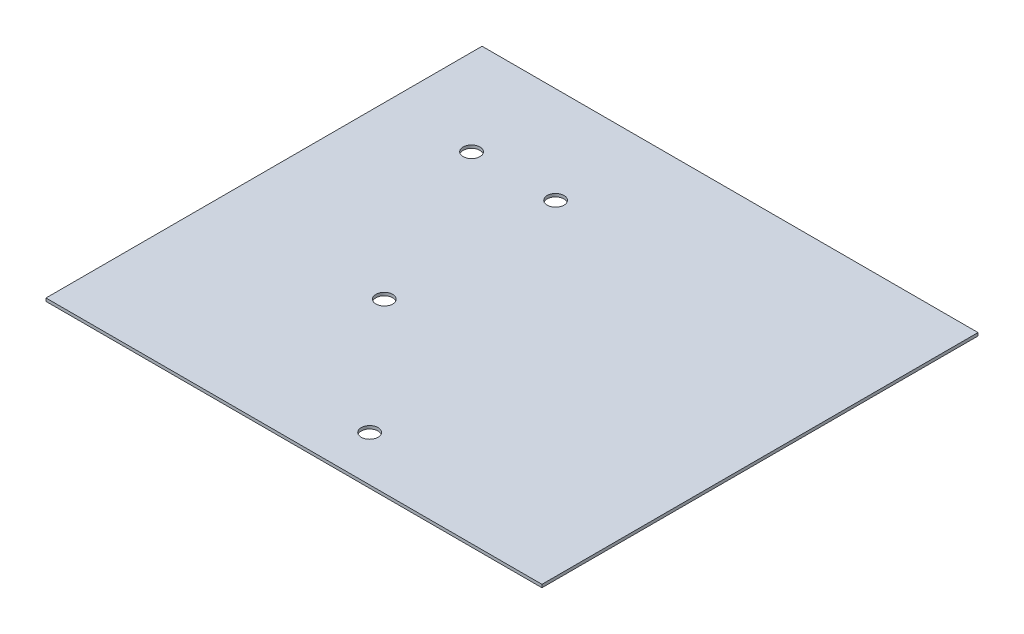
ISO-10303-21;
HEADER;
FILE_DESCRIPTION(('STEP AP214'),'2;1');
FILE_NAME('part.step','',(''),(''),'','','');
FILE_SCHEMA(('AUTOMOTIVE_DESIGN { 1 0 10303 214 1 1 1 1 }'));
ENDSEC;
DATA;
#1=APPLICATION_CONTEXT('core data for automotive mechanical design processes');
#2=APPLICATION_PROTOCOL_DEFINITION('international standard','automotive_design',2000,#1);
#3=PRODUCT_CONTEXT('',#1,'mechanical');
#4=PRODUCT('Part','Part','',(#3));
#5=PRODUCT_RELATED_PRODUCT_CATEGORY('part','',(#4));
#6=PRODUCT_DEFINITION_FORMATION('','',#4);
#7=PRODUCT_DEFINITION_CONTEXT('part definition',#1,'design');
#8=PRODUCT_DEFINITION('design','',#6,#7);
#9=PRODUCT_DEFINITION_SHAPE('','',#8);
#10=(LENGTH_UNIT() NAMED_UNIT(*) SI_UNIT(.MILLI.,.METRE.));
#11=(NAMED_UNIT(*) PLANE_ANGLE_UNIT() SI_UNIT($,.RADIAN.));
#12=(NAMED_UNIT(*) SI_UNIT($,.STERADIAN.) SOLID_ANGLE_UNIT());
#13=UNCERTAINTY_MEASURE_WITH_UNIT(LENGTH_MEASURE(1.E-05),#10,'distance_accuracy_value','');
#14=(GEOMETRIC_REPRESENTATION_CONTEXT(3) GLOBAL_UNCERTAINTY_ASSIGNED_CONTEXT((#13)) GLOBAL_UNIT_ASSIGNED_CONTEXT((#10,
#11,#12)) REPRESENTATION_CONTEXT('',''));
#15=CARTESIAN_POINT('',(0.,0.,0.));
#16=DIRECTION('',(0.,0.,1.));
#17=DIRECTION('',(1.,0.,0.));
#18=AXIS2_PLACEMENT_3D('',#15,#16,#17);
#19=CARTESIAN_POINT('',(0.,0.911859999999987,0.));
#20=DIRECTION('',(0.,-1.,0.));
#21=DIRECTION('',(0.,0.,-1.));
#22=AXIS2_PLACEMENT_3D('',#19,#20,#21);
#23=PLANE('',#22);
#24=DIRECTION('',(0.,0.,1.));
#25=VECTOR('',#24,1.);
#26=CARTESIAN_POINT('',(0.,0.911859999999987,0.));
#27=LINE('',#26,#25);
#28=CARTESIAN_POINT('',(0.,0.911859999999987,-131.7625));
#29=VERTEX_POINT('',#28);
#30=CARTESIAN_POINT('',(0.,0.911859999999987,0.));
#31=VERTEX_POINT('',#30);
#32=EDGE_CURVE('E89',#29,#31,#27,.T.);
#33=ORIENTED_EDGE('',*,*,#32,.T.);
#34=DIRECTION('',(1.,0.,0.));
#35=VECTOR('',#34,1.);
#36=CARTESIAN_POINT('',(0.,0.911859999999987,0.));
#37=LINE('',#36,#35);
#38=CARTESIAN_POINT('',(149.86,0.911859999999987,0.));
#39=VERTEX_POINT('',#38);
#40=EDGE_CURVE('E84',#31,#39,#37,.T.);
#41=ORIENTED_EDGE('',*,*,#40,.T.);
#42=DIRECTION('',(0.,0.,-1.));
#43=VECTOR('',#42,1.);
#44=CARTESIAN_POINT('',(149.86,0.911859999999987,0.));
#45=LINE('',#44,#43);
#46=CARTESIAN_POINT('',(149.86,0.911859999999987,-131.7625));
#47=VERTEX_POINT('',#46);
#48=EDGE_CURVE('E87',#39,#47,#45,.T.);
#49=ORIENTED_EDGE('',*,*,#48,.T.);
#50=DIRECTION('',(-1.,0.,0.));
#51=VECTOR('',#50,1.);
#52=CARTESIAN_POINT('',(0.,0.911859999999987,-131.7625));
#53=LINE('',#52,#51);
#54=EDGE_CURVE('E54',#47,#29,#53,.T.);
#55=ORIENTED_EDGE('',*,*,#54,.T.);
#56=EDGE_LOOP('',(#33,#41,#49,#55));
#57=FACE_BOUND('',#56,.T.);
#58=CARTESIAN_POINT('',(51.435,0.911859999999987,-50.8));
#59=DIRECTION('',(0.,1.,0.));
#60=DIRECTION('',(0.,0.,1.));
#61=AXIS2_PLACEMENT_3D('',#58,#59,#60);
#62=CIRCLE('',#61,2.54);
#63=CARTESIAN_POINT('',(51.435,0.911859999999987,-53.34));
#64=VERTEX_POINT('',#63);
#65=EDGE_CURVE('E110',#64,#64,#62,.T.);
#66=ORIENTED_EDGE('',*,*,#65,.F.);
#67=EDGE_LOOP('',(#66));
#68=FACE_BOUND('',#67,.T.);
#69=CARTESIAN_POINT('',(26.035,0.911859999999987,-102.5525));
#70=DIRECTION('',(0.,1.,0.));
#71=DIRECTION('',(0.,0.,1.));
#72=AXIS2_PLACEMENT_3D('',#69,#70,#71);
#73=CIRCLE('',#72,2.53999999999999);
#74=CARTESIAN_POINT('',(26.035,0.911859999999987,-105.0925));
#75=VERTEX_POINT('',#74);
#76=EDGE_CURVE('E134',#75,#75,#73,.T.);
#77=ORIENTED_EDGE('',*,*,#76,.F.);
#78=EDGE_LOOP('',(#77));
#79=FACE_BOUND('',#78,.T.);
#80=CARTESIAN_POINT('',(51.435,0.911859999999987,-102.5525));
#81=DIRECTION('',(0.,1.,0.));
#82=DIRECTION('',(0.,0.,1.));
#83=AXIS2_PLACEMENT_3D('',#80,#81,#82);
#84=CIRCLE('',#83,2.54);
#85=CARTESIAN_POINT('',(51.435,0.911859999999987,-105.0925));
#86=VERTEX_POINT('',#85);
#87=EDGE_CURVE('E142',#86,#86,#84,.T.);
#88=ORIENTED_EDGE('',*,*,#87,.F.);
#89=EDGE_LOOP('',(#88));
#90=FACE_BOUND('',#89,.T.);
#91=CARTESIAN_POINT('',(84.074,0.911859999999987,-13.716));
#92=DIRECTION('',(0.,1.,0.));
#93=DIRECTION('',(0.,0.,1.));
#94=AXIS2_PLACEMENT_3D('',#91,#92,#93);
#95=CIRCLE('',#94,2.54);
#96=CARTESIAN_POINT('',(84.074,0.911859999999987,-16.256));
#97=VERTEX_POINT('',#96);
#98=EDGE_CURVE('E150',#97,#97,#95,.T.);
#99=ORIENTED_EDGE('',*,*,#98,.F.);
#100=EDGE_LOOP('',(#99));
#101=FACE_BOUND('',#100,.T.);
#102=ADVANCED_FACE('F36',(#57,#68,#79,#90,#101),#23,.F.);
#103=CARTESIAN_POINT('',(0.,0.,0.));
#104=DIRECTION('',(0.,-1.,0.));
#105=DIRECTION('',(0.,0.,-1.));
#106=AXIS2_PLACEMENT_3D('',#103,#104,#105);
#107=PLANE('',#106);
#108=CARTESIAN_POINT('',(51.435,0.,-102.5525));
#109=DIRECTION('',(0.,1.,0.));
#110=DIRECTION('',(0.,0.,1.));
#111=AXIS2_PLACEMENT_3D('',#108,#109,#110);
#112=CIRCLE('',#111,2.54);
#113=CARTESIAN_POINT('',(51.435,0.,-105.0925));
#114=VERTEX_POINT('',#113);
#115=EDGE_CURVE('E146',#114,#114,#112,.T.);
#116=ORIENTED_EDGE('',*,*,#115,.T.);
#117=EDGE_LOOP('',(#116));
#118=FACE_BOUND('',#117,.T.);
#119=CARTESIAN_POINT('',(51.435,0.,-50.8));
#120=DIRECTION('',(0.,1.,0.));
#121=DIRECTION('',(0.,0.,1.));
#122=AXIS2_PLACEMENT_3D('',#119,#120,#121);
#123=CIRCLE('',#122,2.54);
#124=CARTESIAN_POINT('',(51.435,0.,-53.34));
#125=VERTEX_POINT('',#124);
#126=EDGE_CURVE('E130',#125,#125,#123,.T.);
#127=ORIENTED_EDGE('',*,*,#126,.T.);
#128=EDGE_LOOP('',(#127));
#129=FACE_BOUND('',#128,.T.);
#130=DIRECTION('',(0.,0.,1.));
#131=VECTOR('',#130,1.);
#132=CARTESIAN_POINT('',(0.,0.,0.));
#133=LINE('',#132,#131);
#134=CARTESIAN_POINT('',(0.,0.,-131.7625));
#135=VERTEX_POINT('',#134);
#136=CARTESIAN_POINT('',(0.,0.,0.));
#137=VERTEX_POINT('',#136);
#138=EDGE_CURVE('E106',#135,#137,#133,.T.);
#139=ORIENTED_EDGE('',*,*,#138,.F.);
#140=DIRECTION('',(-1.,0.,0.));
#141=VECTOR('',#140,1.);
#142=CARTESIAN_POINT('',(0.,0.,-131.7625));
#143=LINE('',#142,#141);
#144=CARTESIAN_POINT('',(149.86,0.,-131.7625));
#145=VERTEX_POINT('',#144);
#146=EDGE_CURVE('E77',#145,#135,#143,.T.);
#147=ORIENTED_EDGE('',*,*,#146,.F.);
#148=DIRECTION('',(0.,0.,-1.));
#149=VECTOR('',#148,1.);
#150=CARTESIAN_POINT('',(149.86,0.,0.));
#151=LINE('',#150,#149);
#152=CARTESIAN_POINT('',(149.86,0.,0.));
#153=VERTEX_POINT('',#152);
#154=EDGE_CURVE('E71',#153,#145,#151,.T.);
#155=ORIENTED_EDGE('',*,*,#154,.F.);
#156=DIRECTION('',(1.,0.,0.));
#157=VECTOR('',#156,1.);
#158=CARTESIAN_POINT('',(0.,0.,0.));
#159=LINE('',#158,#157);
#160=EDGE_CURVE('E94',#137,#153,#159,.T.);
#161=ORIENTED_EDGE('',*,*,#160,.F.);
#162=EDGE_LOOP('',(#139,#147,#155,#161));
#163=FACE_BOUND('',#162,.T.);
#164=CARTESIAN_POINT('',(26.035,0.,-102.5525));
#165=DIRECTION('',(0.,1.,0.));
#166=DIRECTION('',(0.,0.,1.));
#167=AXIS2_PLACEMENT_3D('',#164,#165,#166);
#168=CIRCLE('',#167,2.53999999999999);
#169=CARTESIAN_POINT('',(26.035,0.,-105.0925));
#170=VERTEX_POINT('',#169);
#171=EDGE_CURVE('E138',#170,#170,#168,.T.);
#172=ORIENTED_EDGE('',*,*,#171,.T.);
#173=EDGE_LOOP('',(#172));
#174=FACE_BOUND('',#173,.T.);
#175=CARTESIAN_POINT('',(84.074,0.,-13.716));
#176=DIRECTION('',(0.,1.,0.));
#177=DIRECTION('',(0.,0.,1.));
#178=AXIS2_PLACEMENT_3D('',#175,#176,#177);
#179=CIRCLE('',#178,2.54);
#180=CARTESIAN_POINT('',(84.074,0.,-16.256));
#181=VERTEX_POINT('',#180);
#182=EDGE_CURVE('E154',#181,#181,#179,.T.);
#183=ORIENTED_EDGE('',*,*,#182,.T.);
#184=EDGE_LOOP('',(#183));
#185=FACE_BOUND('',#184,.T.);
#186=ADVANCED_FACE('F124',(#118,#129,#163,#174,#185),#107,.T.);
#187=CARTESIAN_POINT('',(0.,0.911859999999987,0.));
#188=DIRECTION('',(1.,0.,0.));
#189=DIRECTION('',(0.,0.,-1.));
#190=AXIS2_PLACEMENT_3D('',#187,#188,#189);
#191=PLANE('',#190);
#192=ORIENTED_EDGE('',*,*,#138,.T.);
#193=DIRECTION('',(0.,-1.,0.));
#194=VECTOR('',#193,1.);
#195=CARTESIAN_POINT('',(0.,0.911859999999987,0.));
#196=LINE('',#195,#194);
#197=EDGE_CURVE('E11',#31,#137,#196,.T.);
#198=ORIENTED_EDGE('',*,*,#197,.F.);
#199=ORIENTED_EDGE('',*,*,#32,.F.);
#200=DIRECTION('',(0.,-1.,0.));
#201=VECTOR('',#200,1.);
#202=CARTESIAN_POINT('',(0.,0.911859999999987,-131.7625));
#203=LINE('',#202,#201);
#204=EDGE_CURVE('E102',#29,#135,#203,.T.);
#205=ORIENTED_EDGE('',*,*,#204,.T.);
#206=EDGE_LOOP('',(#192,#198,#199,#205));
#207=FACE_BOUND('',#206,.T.);
#208=ADVANCED_FACE('F38',(#207),#191,.F.);
#209=CARTESIAN_POINT('',(0.,0.911859999999987,0.));
#210=DIRECTION('',(0.,0.,-1.));
#211=DIRECTION('',(-1.,0.,0.));
#212=AXIS2_PLACEMENT_3D('',#209,#210,#211);
#213=PLANE('',#212);
#214=ORIENTED_EDGE('',*,*,#160,.T.);
#215=DIRECTION('',(0.,-1.,0.));
#216=VECTOR('',#215,1.);
#217=CARTESIAN_POINT('',(149.86,0.911859999999987,0.));
#218=LINE('',#217,#216);
#219=EDGE_CURVE('E46',#39,#153,#218,.T.);
#220=ORIENTED_EDGE('',*,*,#219,.F.);
#221=ORIENTED_EDGE('',*,*,#40,.F.);
#222=ORIENTED_EDGE('',*,*,#197,.T.);
#223=EDGE_LOOP('',(#214,#220,#221,#222));
#224=FACE_BOUND('',#223,.T.);
#225=ADVANCED_FACE('F93',(#224),#213,.F.);
#226=CARTESIAN_POINT('',(149.86,0.911859999999987,0.));
#227=DIRECTION('',(-1.,0.,0.));
#228=DIRECTION('',(0.,0.,1.));
#229=AXIS2_PLACEMENT_3D('',#226,#227,#228);
#230=PLANE('',#229);
#231=ORIENTED_EDGE('',*,*,#154,.T.);
#232=DIRECTION('',(0.,-1.,0.));
#233=VECTOR('',#232,1.);
#234=CARTESIAN_POINT('',(149.86,0.911859999999987,-131.7625));
#235=LINE('',#234,#233);
#236=EDGE_CURVE('E96',#47,#145,#235,.T.);
#237=ORIENTED_EDGE('',*,*,#236,.F.);
#238=ORIENTED_EDGE('',*,*,#48,.F.);
#239=ORIENTED_EDGE('',*,*,#219,.T.);
#240=EDGE_LOOP('',(#231,#237,#238,#239));
#241=FACE_BOUND('',#240,.T.);
#242=ADVANCED_FACE('F97',(#241),#230,.F.);
#243=CARTESIAN_POINT('',(0.,0.911859999999987,-131.7625));
#244=DIRECTION('',(0.,0.,1.));
#245=DIRECTION('',(1.,0.,0.));
#246=AXIS2_PLACEMENT_3D('',#243,#244,#245);
#247=PLANE('',#246);
#248=ORIENTED_EDGE('',*,*,#146,.T.);
#249=ORIENTED_EDGE('',*,*,#204,.F.);
#250=ORIENTED_EDGE('',*,*,#54,.F.);
#251=ORIENTED_EDGE('',*,*,#236,.T.);
#252=EDGE_LOOP('',(#248,#249,#250,#251));
#253=FACE_BOUND('',#252,.T.);
#254=ADVANCED_FACE('F121',(#253),#247,.F.);
#255=CARTESIAN_POINT('',(51.435,0.911859999999987,-50.8));
#256=DIRECTION('',(0.,-1.,0.));
#257=DIRECTION('',(0.,0.,-1.));
#258=AXIS2_PLACEMENT_3D('',#255,#256,#257);
#259=CYLINDRICAL_SURFACE('',#258,2.54);
#260=CARTESIAN_POINT('',(51.435,0.911859999999987,-53.34));
#261=CARTESIAN_POINT('',(51.435,0.90236145833332,-53.34));
#262=CARTESIAN_POINT('',(51.435,0.892862916666654,-53.34));
#263=CARTESIAN_POINT('',(51.435,0.873865833333321,-53.34));
#264=CARTESIAN_POINT('',(51.435,0.864367291666654,-53.34));
#265=CARTESIAN_POINT('',(51.435,0.845370208333321,-53.34));
#266=CARTESIAN_POINT('',(51.435,0.835871666666654,-53.34));
#267=CARTESIAN_POINT('',(51.435,0.816874583333321,-53.34));
#268=CARTESIAN_POINT('',(51.435,0.807376041666655,-53.34));
#269=CARTESIAN_POINT('',(51.435,0.788378958333322,-53.34));
#270=CARTESIAN_POINT('',(51.435,0.778880416666655,-53.34));
#271=CARTESIAN_POINT('',(51.435,0.759883333333322,-53.34));
#272=CARTESIAN_POINT('',(51.435,0.750384791666656,-53.34));
#273=CARTESIAN_POINT('',(51.435,0.731387708333323,-53.34));
#274=CARTESIAN_POINT('',(51.435,0.721889166666656,-53.34));
#275=CARTESIAN_POINT('',(51.435,0.702892083333323,-53.34));
#276=CARTESIAN_POINT('',(51.435,0.693393541666657,-53.34));
#277=CARTESIAN_POINT('',(51.435,0.674396458333324,-53.34));
#278=CARTESIAN_POINT('',(51.435,0.664897916666657,-53.34));
#279=CARTESIAN_POINT('',(51.435,0.645900833333324,-53.34));
#280=CARTESIAN_POINT('',(51.435,0.636402291666657,-53.34));
#281=CARTESIAN_POINT('',(51.435,0.617405208333324,-53.34));
#282=CARTESIAN_POINT('',(51.435,0.607906666666658,-53.34));
#283=CARTESIAN_POINT('',(51.435,0.588909583333325,-53.34));
#284=CARTESIAN_POINT('',(51.435,0.579411041666658,-53.34));
#285=CARTESIAN_POINT('',(51.435,0.560413958333325,-53.34));
#286=CARTESIAN_POINT('',(51.435,0.550915416666659,-53.34));
#287=CARTESIAN_POINT('',(51.435,0.531918333333326,-53.34));
#288=CARTESIAN_POINT('',(51.435,0.522419791666659,-53.34));
#289=CARTESIAN_POINT('',(51.435,0.503422708333326,-53.34));
#290=CARTESIAN_POINT('',(51.435,0.49392416666666,-53.34));
#291=CARTESIAN_POINT('',(51.435,0.474927083333326,-53.34));
#292=CARTESIAN_POINT('',(51.435,0.46542854166666,-53.34));
#293=CARTESIAN_POINT('',(51.435,0.446431458333327,-53.34));
#294=CARTESIAN_POINT('',(51.435,0.43693291666666,-53.34));
#295=CARTESIAN_POINT('',(51.435,0.417935833333327,-53.34));
#296=CARTESIAN_POINT('',(51.435,0.408437291666661,-53.34));
#297=CARTESIAN_POINT('',(51.435,0.389440208333328,-53.34));
#298=CARTESIAN_POINT('',(51.435,0.379941666666661,-53.34));
#299=CARTESIAN_POINT('',(51.435,0.360944583333328,-53.34));
#300=CARTESIAN_POINT('',(51.435,0.351446041666662,-53.34));
#301=CARTESIAN_POINT('',(51.435,0.332448958333329,-53.34));
#302=CARTESIAN_POINT('',(51.435,0.322950416666662,-53.34));
#303=CARTESIAN_POINT('',(51.435,0.303953333333329,-53.34));
#304=CARTESIAN_POINT('',(51.435,0.294454791666662,-53.34));
#305=CARTESIAN_POINT('',(51.435,0.275457708333329,-53.34));
#306=CARTESIAN_POINT('',(51.435,0.265959166666663,-53.34));
#307=CARTESIAN_POINT('',(51.435,0.24696208333333,-53.34));
#308=CARTESIAN_POINT('',(51.435,0.237463541666663,-53.34));
#309=CARTESIAN_POINT('',(51.435,0.21846645833333,-53.34));
#310=CARTESIAN_POINT('',(51.435,0.208967916666664,-53.34));
#311=CARTESIAN_POINT('',(51.435,0.189970833333331,-53.34));
#312=CARTESIAN_POINT('',(51.435,0.180472291666664,-53.34));
#313=CARTESIAN_POINT('',(51.435,0.161475208333331,-53.34));
#314=CARTESIAN_POINT('',(51.435,0.151976666666665,-53.34));
#315=CARTESIAN_POINT('',(51.435,0.132979583333331,-53.34));
#316=CARTESIAN_POINT('',(51.435,0.123481041666665,-53.34));
#317=CARTESIAN_POINT('',(51.435,0.104483958333332,-53.34));
#318=CARTESIAN_POINT('',(51.435,0.0949854166666654,-53.34));
#319=CARTESIAN_POINT('',(51.435,0.0759883333333323,-53.34));
#320=CARTESIAN_POINT('',(51.435,0.0664897916666658,-53.34));
#321=CARTESIAN_POINT('',(51.435,0.0474927083333327,-53.34));
#322=CARTESIAN_POINT('',(51.435,0.0379941666666662,-53.34));
#323=CARTESIAN_POINT('',(51.435,0.0189970833333332,-53.34));
#324=CARTESIAN_POINT('',(51.435,0.00949854166666662,-53.34));
#325=CARTESIAN_POINT('',(51.435,0.,-53.34));
#326=B_SPLINE_CURVE_WITH_KNOTS('',3,(#260,#261,#262,#263,#264,#265,#266,#267,#268,#269,#270,
#271,#272,#273,#274,#275,#276,#277,#278,#279,#280,#281,#282,#283,#284,#285,#286,#287,#288,#289,
#290,#291,#292,#293,#294,#295,#296,#297,#298,#299,#300,#301,#302,#303,#304,#305,#306,#307,#308,
#309,#310,#311,#312,#313,#314,#315,#316,#317,#318,#319,#320,#321,#322,#323,#324,#325),
.UNSPECIFIED.,.F.,.F.,(4,2,2,2,2,2,2,2,2,2,2,2,2,2,2,2,2,2,2,2,2,2,2,2,2,2,2,2,2,2,2,2,4),(0.,
0.0284956249999995,0.056991249999999,0.0854868749999986,0.113982499999998,0.142478124999998,
0.170973749999997,0.199469374999997,0.227964999999997,0.256460624999996,0.284956249999996,
0.313451874999995,0.341947499999995,0.370443124999994,0.398938749999994,0.427434374999994,
0.455929999999993,0.484425624999993,0.512921249999992,0.541416874999992,0.569912499999991,
0.598408124999991,0.626903749999991,0.65539937499999,0.68389499999999,0.712390624999989,
0.740886249999989,0.769381874999989,0.797877499999988,0.826373124999988,0.854868749999987,
0.883364374999987,0.911859999999986),.UNSPECIFIED.);
#327=EDGE_CURVE('BSEAM174',#64,#125,#326,.T.);
#328=ORIENTED_EDGE('',*,*,#65,.T.);
#329=ORIENTED_EDGE('',*,*,#126,.F.);
#330=ORIENTED_EDGE('',*,*,#327,.T.);
#331=ORIENTED_EDGE('',*,*,#327,.F.);
#332=EDGE_LOOP('',(#328,#330,#329,#331));
#333=FACE_BOUND('',#332,.T.);
#334=ADVANCED_FACE('F174',(#333),#259,.F.);
#335=CARTESIAN_POINT('',(26.035,0.911859999999987,-102.5525));
#336=DIRECTION('',(0.,-1.,0.));
#337=DIRECTION('',(0.,0.,-1.));
#338=AXIS2_PLACEMENT_3D('',#335,#336,#337);
#339=CYLINDRICAL_SURFACE('',#338,2.53999999999999);
#340=CARTESIAN_POINT('',(26.035,0.911859999999987,-105.0925));
#341=CARTESIAN_POINT('',(26.035,0.90236145833332,-105.0925));
#342=CARTESIAN_POINT('',(26.035,0.892862916666654,-105.0925));
#343=CARTESIAN_POINT('',(26.035,0.873865833333321,-105.0925));
#344=CARTESIAN_POINT('',(26.035,0.864367291666654,-105.0925));
#345=CARTESIAN_POINT('',(26.035,0.845370208333321,-105.0925));
#346=CARTESIAN_POINT('',(26.035,0.835871666666654,-105.0925));
#347=CARTESIAN_POINT('',(26.035,0.816874583333321,-105.0925));
#348=CARTESIAN_POINT('',(26.035,0.807376041666655,-105.0925));
#349=CARTESIAN_POINT('',(26.035,0.788378958333322,-105.0925));
#350=CARTESIAN_POINT('',(26.035,0.778880416666655,-105.0925));
#351=CARTESIAN_POINT('',(26.035,0.759883333333322,-105.0925));
#352=CARTESIAN_POINT('',(26.035,0.750384791666656,-105.0925));
#353=CARTESIAN_POINT('',(26.035,0.731387708333323,-105.0925));
#354=CARTESIAN_POINT('',(26.035,0.721889166666656,-105.0925));
#355=CARTESIAN_POINT('',(26.035,0.702892083333323,-105.0925));
#356=CARTESIAN_POINT('',(26.035,0.693393541666657,-105.0925));
#357=CARTESIAN_POINT('',(26.035,0.674396458333324,-105.0925));
#358=CARTESIAN_POINT('',(26.035,0.664897916666657,-105.0925));
#359=CARTESIAN_POINT('',(26.035,0.645900833333324,-105.0925));
#360=CARTESIAN_POINT('',(26.035,0.636402291666657,-105.0925));
#361=CARTESIAN_POINT('',(26.035,0.617405208333324,-105.0925));
#362=CARTESIAN_POINT('',(26.035,0.607906666666658,-105.0925));
#363=CARTESIAN_POINT('',(26.035,0.588909583333325,-105.0925));
#364=CARTESIAN_POINT('',(26.035,0.579411041666658,-105.0925));
#365=CARTESIAN_POINT('',(26.035,0.560413958333325,-105.0925));
#366=CARTESIAN_POINT('',(26.035,0.550915416666659,-105.0925));
#367=CARTESIAN_POINT('',(26.035,0.531918333333326,-105.0925));
#368=CARTESIAN_POINT('',(26.035,0.522419791666659,-105.0925));
#369=CARTESIAN_POINT('',(26.035,0.503422708333326,-105.0925));
#370=CARTESIAN_POINT('',(26.035,0.49392416666666,-105.0925));
#371=CARTESIAN_POINT('',(26.035,0.474927083333326,-105.0925));
#372=CARTESIAN_POINT('',(26.035,0.46542854166666,-105.0925));
#373=CARTESIAN_POINT('',(26.035,0.446431458333327,-105.0925));
#374=CARTESIAN_POINT('',(26.035,0.43693291666666,-105.0925));
#375=CARTESIAN_POINT('',(26.035,0.417935833333327,-105.0925));
#376=CARTESIAN_POINT('',(26.035,0.408437291666661,-105.0925));
#377=CARTESIAN_POINT('',(26.035,0.389440208333328,-105.0925));
#378=CARTESIAN_POINT('',(26.035,0.379941666666661,-105.0925));
#379=CARTESIAN_POINT('',(26.035,0.360944583333328,-105.0925));
#380=CARTESIAN_POINT('',(26.035,0.351446041666662,-105.0925));
#381=CARTESIAN_POINT('',(26.035,0.332448958333329,-105.0925));
#382=CARTESIAN_POINT('',(26.035,0.322950416666662,-105.0925));
#383=CARTESIAN_POINT('',(26.035,0.303953333333329,-105.0925));
#384=CARTESIAN_POINT('',(26.035,0.294454791666662,-105.0925));
#385=CARTESIAN_POINT('',(26.035,0.275457708333329,-105.0925));
#386=CARTESIAN_POINT('',(26.035,0.265959166666663,-105.0925));
#387=CARTESIAN_POINT('',(26.035,0.24696208333333,-105.0925));
#388=CARTESIAN_POINT('',(26.035,0.237463541666663,-105.0925));
#389=CARTESIAN_POINT('',(26.035,0.21846645833333,-105.0925));
#390=CARTESIAN_POINT('',(26.035,0.208967916666664,-105.0925));
#391=CARTESIAN_POINT('',(26.035,0.189970833333331,-105.0925));
#392=CARTESIAN_POINT('',(26.035,0.180472291666664,-105.0925));
#393=CARTESIAN_POINT('',(26.035,0.161475208333331,-105.0925));
#394=CARTESIAN_POINT('',(26.035,0.151976666666665,-105.0925));
#395=CARTESIAN_POINT('',(26.035,0.132979583333331,-105.0925));
#396=CARTESIAN_POINT('',(26.035,0.123481041666665,-105.0925));
#397=CARTESIAN_POINT('',(26.035,0.104483958333332,-105.0925));
#398=CARTESIAN_POINT('',(26.035,0.0949854166666654,-105.0925));
#399=CARTESIAN_POINT('',(26.035,0.0759883333333323,-105.0925));
#400=CARTESIAN_POINT('',(26.035,0.0664897916666658,-105.0925));
#401=CARTESIAN_POINT('',(26.035,0.0474927083333327,-105.0925));
#402=CARTESIAN_POINT('',(26.035,0.0379941666666662,-105.0925));
#403=CARTESIAN_POINT('',(26.035,0.0189970833333332,-105.0925));
#404=CARTESIAN_POINT('',(26.035,0.00949854166666662,-105.0925));
#405=CARTESIAN_POINT('',(26.035,0.,-105.0925));
#406=B_SPLINE_CURVE_WITH_KNOTS('',3,(#340,#341,#342,#343,#344,#345,#346,#347,#348,#349,#350,
#351,#352,#353,#354,#355,#356,#357,#358,#359,#360,#361,#362,#363,#364,#365,#366,#367,#368,#369,
#370,#371,#372,#373,#374,#375,#376,#377,#378,#379,#380,#381,#382,#383,#384,#385,#386,#387,#388,
#389,#390,#391,#392,#393,#394,#395,#396,#397,#398,#399,#400,#401,#402,#403,#404,#405),
.UNSPECIFIED.,.F.,.F.,(4,2,2,2,2,2,2,2,2,2,2,2,2,2,2,2,2,2,2,2,2,2,2,2,2,2,2,2,2,2,2,2,4),(0.,
0.0284956249999995,0.056991249999999,0.0854868749999986,0.113982499999998,0.142478124999998,
0.170973749999997,0.199469374999997,0.227964999999997,0.256460624999996,0.284956249999996,
0.313451874999995,0.341947499999995,0.370443124999994,0.398938749999994,0.427434374999994,
0.455929999999993,0.484425624999993,0.512921249999992,0.541416874999992,0.569912499999991,
0.598408124999991,0.626903749999991,0.65539937499999,0.68389499999999,0.712390624999989,
0.740886249999989,0.769381874999989,0.797877499999988,0.826373124999988,0.854868749999987,
0.883364374999987,0.911859999999986),.UNSPECIFIED.);
#407=EDGE_CURVE('BSEAM220',#75,#170,#406,.T.);
#408=ORIENTED_EDGE('',*,*,#76,.T.);
#409=ORIENTED_EDGE('',*,*,#171,.F.);
#410=ORIENTED_EDGE('',*,*,#407,.T.);
#411=ORIENTED_EDGE('',*,*,#407,.F.);
#412=EDGE_LOOP('',(#408,#410,#409,#411));
#413=FACE_BOUND('',#412,.T.);
#414=ADVANCED_FACE('F220',(#413),#339,.F.);
#415=CARTESIAN_POINT('',(51.435,0.911859999999987,-102.5525));
#416=DIRECTION('',(0.,-1.,0.));
#417=DIRECTION('',(0.,0.,-1.));
#418=AXIS2_PLACEMENT_3D('',#415,#416,#417);
#419=CYLINDRICAL_SURFACE('',#418,2.54);
#420=CARTESIAN_POINT('',(51.435,0.911859999999987,-105.0925));
#421=CARTESIAN_POINT('',(51.435,0.90236145833332,-105.0925));
#422=CARTESIAN_POINT('',(51.435,0.892862916666654,-105.0925));
#423=CARTESIAN_POINT('',(51.435,0.873865833333321,-105.0925));
#424=CARTESIAN_POINT('',(51.435,0.864367291666654,-105.0925));
#425=CARTESIAN_POINT('',(51.435,0.845370208333321,-105.0925));
#426=CARTESIAN_POINT('',(51.435,0.835871666666654,-105.0925));
#427=CARTESIAN_POINT('',(51.435,0.816874583333321,-105.0925));
#428=CARTESIAN_POINT('',(51.435,0.807376041666655,-105.0925));
#429=CARTESIAN_POINT('',(51.435,0.788378958333322,-105.0925));
#430=CARTESIAN_POINT('',(51.435,0.778880416666655,-105.0925));
#431=CARTESIAN_POINT('',(51.435,0.759883333333322,-105.0925));
#432=CARTESIAN_POINT('',(51.435,0.750384791666656,-105.0925));
#433=CARTESIAN_POINT('',(51.435,0.731387708333323,-105.0925));
#434=CARTESIAN_POINT('',(51.435,0.721889166666656,-105.0925));
#435=CARTESIAN_POINT('',(51.435,0.702892083333323,-105.0925));
#436=CARTESIAN_POINT('',(51.435,0.693393541666657,-105.0925));
#437=CARTESIAN_POINT('',(51.435,0.674396458333324,-105.0925));
#438=CARTESIAN_POINT('',(51.435,0.664897916666657,-105.0925));
#439=CARTESIAN_POINT('',(51.435,0.645900833333324,-105.0925));
#440=CARTESIAN_POINT('',(51.435,0.636402291666657,-105.0925));
#441=CARTESIAN_POINT('',(51.435,0.617405208333324,-105.0925));
#442=CARTESIAN_POINT('',(51.435,0.607906666666658,-105.0925));
#443=CARTESIAN_POINT('',(51.435,0.588909583333325,-105.0925));
#444=CARTESIAN_POINT('',(51.435,0.579411041666658,-105.0925));
#445=CARTESIAN_POINT('',(51.435,0.560413958333325,-105.0925));
#446=CARTESIAN_POINT('',(51.435,0.550915416666659,-105.0925));
#447=CARTESIAN_POINT('',(51.435,0.531918333333326,-105.0925));
#448=CARTESIAN_POINT('',(51.435,0.522419791666659,-105.0925));
#449=CARTESIAN_POINT('',(51.435,0.503422708333326,-105.0925));
#450=CARTESIAN_POINT('',(51.435,0.49392416666666,-105.0925));
#451=CARTESIAN_POINT('',(51.435,0.474927083333326,-105.0925));
#452=CARTESIAN_POINT('',(51.435,0.46542854166666,-105.0925));
#453=CARTESIAN_POINT('',(51.435,0.446431458333327,-105.0925));
#454=CARTESIAN_POINT('',(51.435,0.43693291666666,-105.0925));
#455=CARTESIAN_POINT('',(51.435,0.417935833333327,-105.0925));
#456=CARTESIAN_POINT('',(51.435,0.408437291666661,-105.0925));
#457=CARTESIAN_POINT('',(51.435,0.389440208333328,-105.0925));
#458=CARTESIAN_POINT('',(51.435,0.379941666666661,-105.0925));
#459=CARTESIAN_POINT('',(51.435,0.360944583333328,-105.0925));
#460=CARTESIAN_POINT('',(51.435,0.351446041666662,-105.0925));
#461=CARTESIAN_POINT('',(51.435,0.332448958333329,-105.0925));
#462=CARTESIAN_POINT('',(51.435,0.322950416666662,-105.0925));
#463=CARTESIAN_POINT('',(51.435,0.303953333333329,-105.0925));
#464=CARTESIAN_POINT('',(51.435,0.294454791666662,-105.0925));
#465=CARTESIAN_POINT('',(51.435,0.275457708333329,-105.0925));
#466=CARTESIAN_POINT('',(51.435,0.265959166666663,-105.0925));
#467=CARTESIAN_POINT('',(51.435,0.24696208333333,-105.0925));
#468=CARTESIAN_POINT('',(51.435,0.237463541666663,-105.0925));
#469=CARTESIAN_POINT('',(51.435,0.21846645833333,-105.0925));
#470=CARTESIAN_POINT('',(51.435,0.208967916666664,-105.0925));
#471=CARTESIAN_POINT('',(51.435,0.189970833333331,-105.0925));
#472=CARTESIAN_POINT('',(51.435,0.180472291666664,-105.0925));
#473=CARTESIAN_POINT('',(51.435,0.161475208333331,-105.0925));
#474=CARTESIAN_POINT('',(51.435,0.151976666666665,-105.0925));
#475=CARTESIAN_POINT('',(51.435,0.132979583333331,-105.0925));
#476=CARTESIAN_POINT('',(51.435,0.123481041666665,-105.0925));
#477=CARTESIAN_POINT('',(51.435,0.104483958333332,-105.0925));
#478=CARTESIAN_POINT('',(51.435,0.0949854166666654,-105.0925));
#479=CARTESIAN_POINT('',(51.435,0.0759883333333323,-105.0925));
#480=CARTESIAN_POINT('',(51.435,0.0664897916666658,-105.0925));
#481=CARTESIAN_POINT('',(51.435,0.0474927083333327,-105.0925));
#482=CARTESIAN_POINT('',(51.435,0.0379941666666662,-105.0925));
#483=CARTESIAN_POINT('',(51.435,0.0189970833333332,-105.0925));
#484=CARTESIAN_POINT('',(51.435,0.00949854166666662,-105.0925));
#485=CARTESIAN_POINT('',(51.435,0.,-105.0925));
#486=B_SPLINE_CURVE_WITH_KNOTS('',3,(#420,#421,#422,#423,#424,#425,#426,#427,#428,#429,#430,
#431,#432,#433,#434,#435,#436,#437,#438,#439,#440,#441,#442,#443,#444,#445,#446,#447,#448,#449,
#450,#451,#452,#453,#454,#455,#456,#457,#458,#459,#460,#461,#462,#463,#464,#465,#466,#467,#468,
#469,#470,#471,#472,#473,#474,#475,#476,#477,#478,#479,#480,#481,#482,#483,#484,#485),
.UNSPECIFIED.,.F.,.F.,(4,2,2,2,2,2,2,2,2,2,2,2,2,2,2,2,2,2,2,2,2,2,2,2,2,2,2,2,2,2,2,2,4),(0.,
0.0284956249999995,0.056991249999999,0.0854868749999986,0.113982499999998,0.142478124999998,
0.170973749999997,0.199469374999997,0.227964999999997,0.256460624999996,0.284956249999996,
0.313451874999995,0.341947499999995,0.370443124999994,0.398938749999994,0.427434374999994,
0.455929999999993,0.484425624999993,0.512921249999992,0.541416874999992,0.569912499999991,
0.598408124999991,0.626903749999991,0.65539937499999,0.68389499999999,0.712390624999989,
0.740886249999989,0.769381874999989,0.797877499999988,0.826373124999988,0.854868749999987,
0.883364374999987,0.911859999999986),.UNSPECIFIED.);
#487=EDGE_CURVE('BSEAM228',#86,#114,#486,.T.);
#488=ORIENTED_EDGE('',*,*,#87,.T.);
#489=ORIENTED_EDGE('',*,*,#115,.F.);
#490=ORIENTED_EDGE('',*,*,#487,.T.);
#491=ORIENTED_EDGE('',*,*,#487,.F.);
#492=EDGE_LOOP('',(#488,#490,#489,#491));
#493=FACE_BOUND('',#492,.T.);
#494=ADVANCED_FACE('F228',(#493),#419,.F.);
#495=CARTESIAN_POINT('',(84.074,0.911859999999987,-13.716));
#496=DIRECTION('',(0.,-1.,0.));
#497=DIRECTION('',(0.,0.,-1.));
#498=AXIS2_PLACEMENT_3D('',#495,#496,#497);
#499=CYLINDRICAL_SURFACE('',#498,2.54);
#500=CARTESIAN_POINT('',(84.074,0.911859999999987,-16.256));
#501=CARTESIAN_POINT('',(84.074,0.90236145833332,-16.256));
#502=CARTESIAN_POINT('',(84.074,0.892862916666654,-16.256));
#503=CARTESIAN_POINT('',(84.074,0.873865833333321,-16.256));
#504=CARTESIAN_POINT('',(84.074,0.864367291666654,-16.256));
#505=CARTESIAN_POINT('',(84.074,0.845370208333321,-16.256));
#506=CARTESIAN_POINT('',(84.074,0.835871666666654,-16.256));
#507=CARTESIAN_POINT('',(84.074,0.816874583333321,-16.256));
#508=CARTESIAN_POINT('',(84.074,0.807376041666655,-16.256));
#509=CARTESIAN_POINT('',(84.074,0.788378958333322,-16.256));
#510=CARTESIAN_POINT('',(84.074,0.778880416666655,-16.256));
#511=CARTESIAN_POINT('',(84.074,0.759883333333322,-16.256));
#512=CARTESIAN_POINT('',(84.074,0.750384791666656,-16.256));
#513=CARTESIAN_POINT('',(84.074,0.731387708333323,-16.256));
#514=CARTESIAN_POINT('',(84.074,0.721889166666656,-16.256));
#515=CARTESIAN_POINT('',(84.074,0.702892083333323,-16.256));
#516=CARTESIAN_POINT('',(84.074,0.693393541666657,-16.256));
#517=CARTESIAN_POINT('',(84.074,0.674396458333324,-16.256));
#518=CARTESIAN_POINT('',(84.074,0.664897916666657,-16.256));
#519=CARTESIAN_POINT('',(84.074,0.645900833333324,-16.256));
#520=CARTESIAN_POINT('',(84.074,0.636402291666657,-16.256));
#521=CARTESIAN_POINT('',(84.074,0.617405208333324,-16.256));
#522=CARTESIAN_POINT('',(84.074,0.607906666666658,-16.256));
#523=CARTESIAN_POINT('',(84.074,0.588909583333325,-16.256));
#524=CARTESIAN_POINT('',(84.074,0.579411041666658,-16.256));
#525=CARTESIAN_POINT('',(84.074,0.560413958333325,-16.256));
#526=CARTESIAN_POINT('',(84.074,0.550915416666659,-16.256));
#527=CARTESIAN_POINT('',(84.074,0.531918333333326,-16.256));
#528=CARTESIAN_POINT('',(84.074,0.522419791666659,-16.256));
#529=CARTESIAN_POINT('',(84.074,0.503422708333326,-16.256));
#530=CARTESIAN_POINT('',(84.074,0.49392416666666,-16.256));
#531=CARTESIAN_POINT('',(84.074,0.474927083333326,-16.256));
#532=CARTESIAN_POINT('',(84.074,0.46542854166666,-16.256));
#533=CARTESIAN_POINT('',(84.074,0.446431458333327,-16.256));
#534=CARTESIAN_POINT('',(84.074,0.43693291666666,-16.256));
#535=CARTESIAN_POINT('',(84.074,0.417935833333327,-16.256));
#536=CARTESIAN_POINT('',(84.074,0.408437291666661,-16.256));
#537=CARTESIAN_POINT('',(84.074,0.389440208333328,-16.256));
#538=CARTESIAN_POINT('',(84.074,0.379941666666661,-16.256));
#539=CARTESIAN_POINT('',(84.074,0.360944583333328,-16.256));
#540=CARTESIAN_POINT('',(84.074,0.351446041666662,-16.256));
#541=CARTESIAN_POINT('',(84.074,0.332448958333329,-16.256));
#542=CARTESIAN_POINT('',(84.074,0.322950416666662,-16.256));
#543=CARTESIAN_POINT('',(84.074,0.303953333333329,-16.256));
#544=CARTESIAN_POINT('',(84.074,0.294454791666662,-16.256));
#545=CARTESIAN_POINT('',(84.074,0.275457708333329,-16.256));
#546=CARTESIAN_POINT('',(84.074,0.265959166666663,-16.256));
#547=CARTESIAN_POINT('',(84.074,0.24696208333333,-16.256));
#548=CARTESIAN_POINT('',(84.074,0.237463541666663,-16.256));
#549=CARTESIAN_POINT('',(84.074,0.21846645833333,-16.256));
#550=CARTESIAN_POINT('',(84.074,0.208967916666664,-16.256));
#551=CARTESIAN_POINT('',(84.074,0.189970833333331,-16.256));
#552=CARTESIAN_POINT('',(84.074,0.180472291666664,-16.256));
#553=CARTESIAN_POINT('',(84.074,0.161475208333331,-16.256));
#554=CARTESIAN_POINT('',(84.074,0.151976666666665,-16.256));
#555=CARTESIAN_POINT('',(84.074,0.132979583333331,-16.256));
#556=CARTESIAN_POINT('',(84.074,0.123481041666665,-16.256));
#557=CARTESIAN_POINT('',(84.074,0.104483958333332,-16.256));
#558=CARTESIAN_POINT('',(84.074,0.0949854166666654,-16.256));
#559=CARTESIAN_POINT('',(84.074,0.0759883333333323,-16.256));
#560=CARTESIAN_POINT('',(84.074,0.0664897916666658,-16.256));
#561=CARTESIAN_POINT('',(84.074,0.0474927083333327,-16.256));
#562=CARTESIAN_POINT('',(84.074,0.0379941666666662,-16.256));
#563=CARTESIAN_POINT('',(84.074,0.0189970833333332,-16.256));
#564=CARTESIAN_POINT('',(84.074,0.00949854166666662,-16.256));
#565=CARTESIAN_POINT('',(84.074,0.,-16.256));
#566=B_SPLINE_CURVE_WITH_KNOTS('',3,(#500,#501,#502,#503,#504,#505,#506,#507,#508,#509,#510,
#511,#512,#513,#514,#515,#516,#517,#518,#519,#520,#521,#522,#523,#524,#525,#526,#527,#528,#529,
#530,#531,#532,#533,#534,#535,#536,#537,#538,#539,#540,#541,#542,#543,#544,#545,#546,#547,#548,
#549,#550,#551,#552,#553,#554,#555,#556,#557,#558,#559,#560,#561,#562,#563,#564,#565),
.UNSPECIFIED.,.F.,.F.,(4,2,2,2,2,2,2,2,2,2,2,2,2,2,2,2,2,2,2,2,2,2,2,2,2,2,2,2,2,2,2,2,4),(0.,
0.0284956249999995,0.056991249999999,0.0854868749999986,0.113982499999998,0.142478124999998,
0.170973749999997,0.199469374999997,0.227964999999997,0.256460624999996,0.284956249999996,
0.313451874999995,0.341947499999995,0.370443124999994,0.398938749999994,0.427434374999994,
0.455929999999993,0.484425624999993,0.512921249999992,0.541416874999992,0.569912499999991,
0.598408124999991,0.626903749999991,0.65539937499999,0.68389499999999,0.712390624999989,
0.740886249999989,0.769381874999989,0.797877499999988,0.826373124999988,0.854868749999987,
0.883364374999987,0.911859999999986),.UNSPECIFIED.);
#567=EDGE_CURVE('BSEAM163',#97,#181,#566,.T.);
#568=ORIENTED_EDGE('',*,*,#98,.T.);
#569=ORIENTED_EDGE('',*,*,#182,.F.);
#570=ORIENTED_EDGE('',*,*,#567,.T.);
#571=ORIENTED_EDGE('',*,*,#567,.F.);
#572=EDGE_LOOP('',(#568,#570,#569,#571));
#573=FACE_BOUND('',#572,.T.);
#574=ADVANCED_FACE('F163',(#573),#499,.F.);
#575=CLOSED_SHELL('',(#102,#186,#208,#225,#242,#254,#334,#414,#494,#574));
#576=MANIFOLD_SOLID_BREP('B2',#575);
#577=ADVANCED_BREP_SHAPE_REPRESENTATION('',(#18,#576),#14);
#578=SHAPE_DEFINITION_REPRESENTATION(#9,#577);
ENDSEC;
END-ISO-10303-21;
